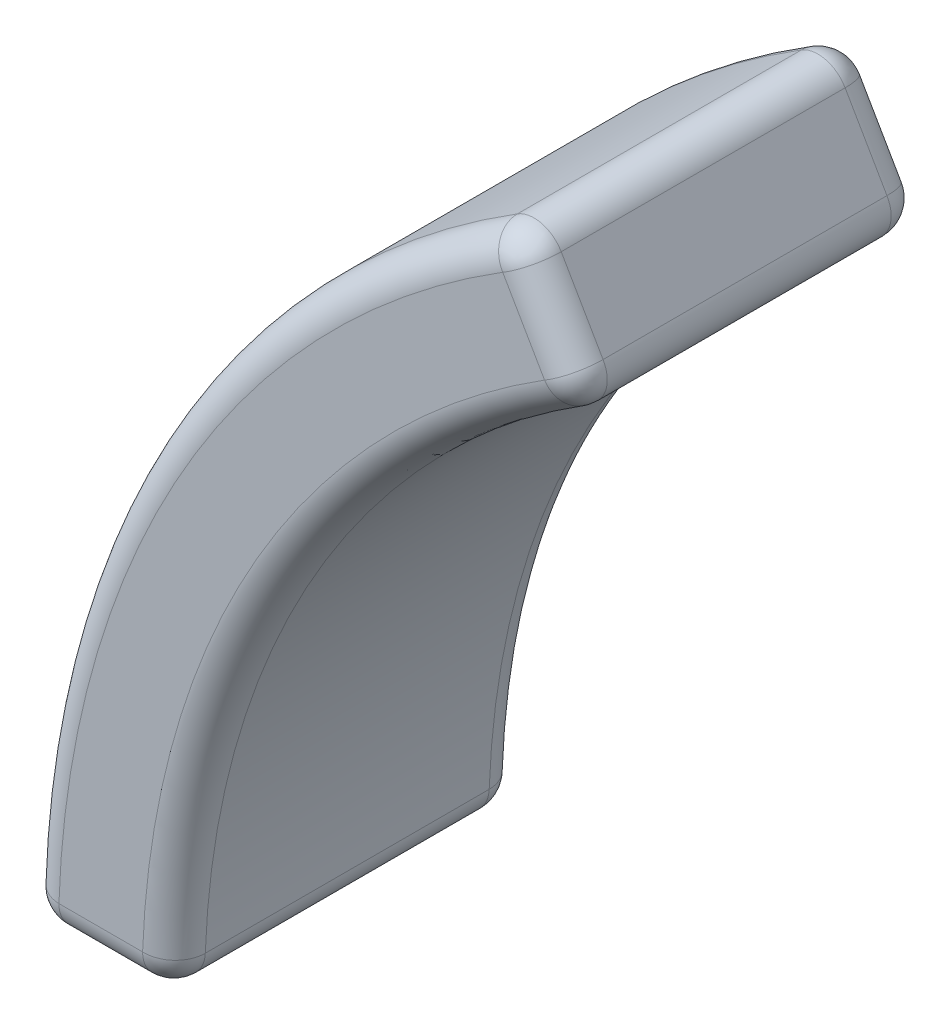
ISO-10303-21;
HEADER;
FILE_DESCRIPTION(('STEP AP214'),'2;1');
FILE_NAME('part.step','',(''),(''),'','','');
FILE_SCHEMA(('AUTOMOTIVE_DESIGN { 1 0 10303 214 1 1 1 1 }'));
ENDSEC;
DATA;
#1=APPLICATION_CONTEXT('core data for automotive mechanical design processes');
#2=APPLICATION_PROTOCOL_DEFINITION('international standard','automotive_design',2000,#1);
#3=PRODUCT_CONTEXT('',#1,'mechanical');
#4=PRODUCT('Part','Part','',(#3));
#5=PRODUCT_RELATED_PRODUCT_CATEGORY('part','',(#4));
#6=PRODUCT_DEFINITION_FORMATION('','',#4);
#7=PRODUCT_DEFINITION_CONTEXT('part definition',#1,'design');
#8=PRODUCT_DEFINITION('design','',#6,#7);
#9=PRODUCT_DEFINITION_SHAPE('','',#8);
#10=(LENGTH_UNIT() NAMED_UNIT(*) SI_UNIT(.MILLI.,.METRE.));
#11=(NAMED_UNIT(*) PLANE_ANGLE_UNIT() SI_UNIT($,.RADIAN.));
#12=(NAMED_UNIT(*) SI_UNIT($,.STERADIAN.) SOLID_ANGLE_UNIT());
#13=UNCERTAINTY_MEASURE_WITH_UNIT(LENGTH_MEASURE(1.E-05),#10,'distance_accuracy_value','');
#14=(GEOMETRIC_REPRESENTATION_CONTEXT(3) GLOBAL_UNCERTAINTY_ASSIGNED_CONTEXT((#13)) GLOBAL_UNIT_ASSIGNED_CONTEXT((#10,
#11,#12)) REPRESENTATION_CONTEXT('',''));
#15=CARTESIAN_POINT('',(0.,0.,0.));
#16=DIRECTION('',(0.,0.,1.));
#17=DIRECTION('',(1.,0.,0.));
#18=AXIS2_PLACEMENT_3D('',#15,#16,#17);
#19=CARTESIAN_POINT('',(0.,0.,-331.6));
#20=DIRECTION('',(0.,0.,1.));
#21=DIRECTION('',(1.,0.,0.));
#22=AXIS2_PLACEMENT_3D('',#19,#20,#21);
#23=CYLINDRICAL_SURFACE('',#22,791.6);
#24=CARTESIAN_POINT('',(0.,0.,-301.6));
#25=DIRECTION('',(0.,0.,1.));
#26=DIRECTION('',(1.,0.,0.));
#27=AXIS2_PLACEMENT_3D('',#24,#25,#26);
#28=CIRCLE('',#27,791.6);
#29=CARTESIAN_POINT('',(-791.072111416553,28.904576436222,-301.6));
#30=VERTEX_POINT('',#29);
#31=CARTESIAN_POINT('',(-420.568153187672,670.636256494018,-301.6));
#32=VERTEX_POINT('',#31);
#33=EDGE_CURVE('E250',#30,#32,#28,.F.);
#34=ORIENTED_EDGE('',*,*,#33,.T.);
#35=DIRECTION('',(0.,0.,1.));
#36=VECTOR('',#35,1.);
#37=CARTESIAN_POINT('',(-420.568153187672,670.636256494018,-331.6));
#38=LINE('',#37,#36);
#39=CARTESIAN_POINT('',(-420.568153187672,670.636256494018,-30.));
#40=VERTEX_POINT('',#39);
#41=EDGE_CURVE('E262',#32,#40,#38,.T.);
#42=ORIENTED_EDGE('',*,*,#41,.T.);
#43=CARTESIAN_POINT('',(0.,0.,-30.));
#44=DIRECTION('',(0.,0.,1.));
#45=DIRECTION('',(1.,0.,0.));
#46=AXIS2_PLACEMENT_3D('',#43,#44,#45);
#47=CIRCLE('',#46,791.6);
#48=CARTESIAN_POINT('',(-791.072111416553,28.904576436222,-30.));
#49=VERTEX_POINT('',#48);
#50=EDGE_CURVE('E254',#40,#49,#47,.T.);
#51=ORIENTED_EDGE('',*,*,#50,.T.);
#52=DIRECTION('',(0.,0.,1.));
#53=VECTOR('',#52,1.);
#54=CARTESIAN_POINT('',(-791.072111416553,28.904576436222,-331.6));
#55=LINE('',#54,#53);
#56=EDGE_CURVE('E246',#49,#30,#55,.F.);
#57=ORIENTED_EDGE('',*,*,#56,.T.);
#58=EDGE_LOOP('',(#34,#42,#51,#57));
#59=FACE_BOUND('',#58,.T.);
#60=ADVANCED_FACE('F43',(#59),#23,.F.);
#61=CARTESIAN_POINT('',(-791.6,0.,-331.6));
#62=DIRECTION('',(0.,-1.,0.));
#63=DIRECTION('',(1.,0.,0.));
#64=AXIS2_PLACEMENT_3D('',#61,#62,#63);
#65=PLANE('',#64);
#66=DIRECTION('',(1.,0.,0.));
#67=VECTOR('',#66,1.);
#68=CARTESIAN_POINT('',(-791.6,0.,-30.));
#69=LINE('',#68,#67);
#70=CARTESIAN_POINT('',(-821.052105532895,0.,-30.));
#71=VERTEX_POINT('',#70);
#72=CARTESIAN_POINT('',(-901.100749084141,0.,-30.));
#73=VERTEX_POINT('',#72);
#74=EDGE_CURVE('E64',#71,#73,#69,.F.);
#75=ORIENTED_EDGE('',*,*,#74,.T.);
#76=DIRECTION('',(0.,0.,1.));
#77=VECTOR('',#76,1.);
#78=CARTESIAN_POINT('',(-901.100749084141,0.,-331.6));
#79=LINE('',#78,#77);
#80=CARTESIAN_POINT('',(-901.100749084141,0.,-301.6));
#81=VERTEX_POINT('',#80);
#82=EDGE_CURVE('E11',#73,#81,#79,.F.);
#83=ORIENTED_EDGE('',*,*,#82,.T.);
#84=DIRECTION('',(1.,0.,0.));
#85=VECTOR('',#84,1.);
#86=CARTESIAN_POINT('',(-791.6,0.,-301.6));
#87=LINE('',#86,#85);
#88=CARTESIAN_POINT('',(-821.052105532895,0.,-301.6));
#89=VERTEX_POINT('',#88);
#90=EDGE_CURVE('E53',#81,#89,#87,.T.);
#91=ORIENTED_EDGE('',*,*,#90,.T.);
#92=DIRECTION('',(0.,0.,1.));
#93=VECTOR('',#92,1.);
#94=CARTESIAN_POINT('',(-821.052105532895,0.,-331.6));
#95=LINE('',#94,#93);
#96=EDGE_CURVE('E245',#89,#71,#95,.T.);
#97=ORIENTED_EDGE('',*,*,#96,.T.);
#98=EDGE_LOOP('',(#75,#83,#91,#97));
#99=FACE_BOUND('',#98,.T.);
#100=ADVANCED_FACE('F384',(#99),#65,.T.);
#101=CARTESIAN_POINT('',(0.,0.,-331.6));
#102=DIRECTION('',(0.,0.,1.));
#103=DIRECTION('',(1.,0.,0.));
#104=AXIS2_PLACEMENT_3D('',#101,#102,#103);
#105=CYLINDRICAL_SURFACE('',#104,931.6);
#106=CARTESIAN_POINT('',(0.,0.,-30.));
#107=DIRECTION('',(0.,0.,1.));
#108=DIRECTION('',(1.,0.,0.));
#109=AXIS2_PLACEMENT_3D('',#106,#107,#108);
#110=CIRCLE('',#109,931.6);
#111=CARTESIAN_POINT('',(-931.084136919682,30.9982253771074,-30.));
#112=VERTEX_POINT('',#111);
#113=CARTESIAN_POINT('',(-492.38731910865,790.843402944601,-30.));
#114=VERTEX_POINT('',#113);
#115=EDGE_CURVE('E332',#112,#114,#110,.F.);
#116=ORIENTED_EDGE('',*,*,#115,.T.);
#117=DIRECTION('',(0.,0.,1.));
#118=VECTOR('',#117,1.);
#119=CARTESIAN_POINT('',(-492.38731910865,790.843402944601,-331.6));
#120=LINE('',#119,#118);
#121=CARTESIAN_POINT('',(-492.38731910865,790.843402944601,-301.6));
#122=VERTEX_POINT('',#121);
#123=EDGE_CURVE('E169',#114,#122,#120,.F.);
#124=ORIENTED_EDGE('',*,*,#123,.T.);
#125=CARTESIAN_POINT('',(0.,0.,-301.6));
#126=DIRECTION('',(0.,0.,1.));
#127=DIRECTION('',(1.,0.,0.));
#128=AXIS2_PLACEMENT_3D('',#125,#126,#127);
#129=CIRCLE('',#128,931.6);
#130=CARTESIAN_POINT('',(-931.084136919682,30.9982253771074,-301.6));
#131=VERTEX_POINT('',#130);
#132=EDGE_CURVE('E256',#122,#131,#129,.T.);
#133=ORIENTED_EDGE('',*,*,#132,.T.);
#134=DIRECTION('',(0.,0.,1.));
#135=VECTOR('',#134,1.);
#136=CARTESIAN_POINT('',(-931.084136919682,30.9982253771074,-331.6));
#137=LINE('',#136,#135);
#138=EDGE_CURVE('E328',#131,#112,#137,.T.);
#139=ORIENTED_EDGE('',*,*,#138,.T.);
#140=EDGE_LOOP('',(#116,#124,#133,#139));
#141=FACE_BOUND('',#140,.T.);
#142=ADVANCED_FACE('F341',(#141),#105,.T.);
#143=CARTESIAN_POINT('',(-395.799999999999,685.545709635763,-331.6));
#144=DIRECTION('',(0.86602540378444,0.499999999999998,0.));
#145=DIRECTION('',(-0.499999999999998,0.86602540378444,0.));
#146=AXIS2_PLACEMENT_3D('',#143,#144,#145);
#147=PLANE('',#146);
#148=DIRECTION('',(0.,0.,1.));
#149=VECTOR('',#148,1.);
#150=CARTESIAN_POINT('',(-410.526052766446,711.05198122219,-331.6));
#151=LINE('',#150,#149);
#152=CARTESIAN_POINT('',(-410.526052766446,711.05198122219,-30.));
#153=VERTEX_POINT('',#152);
#154=CARTESIAN_POINT('',(-410.526052766446,711.05198122219,-301.6));
#155=VERTEX_POINT('',#154);
#156=EDGE_CURVE('E144',#153,#155,#151,.F.);
#157=ORIENTED_EDGE('',*,*,#156,.T.);
#158=DIRECTION('',(-0.499999999999998,0.86602540378444,0.));
#159=VECTOR('',#158,1.);
#160=CARTESIAN_POINT('',(-465.799999999998,806.789266165584,-301.6));
#161=LINE('',#160,#159);
#162=CARTESIAN_POINT('',(-450.550374542069,780.376140076054,-301.6));
#163=VERTEX_POINT('',#162);
#164=EDGE_CURVE('E139',#155,#163,#161,.T.);
#165=ORIENTED_EDGE('',*,*,#164,.T.);
#166=DIRECTION('',(0.,0.,1.));
#167=VECTOR('',#166,1.);
#168=CARTESIAN_POINT('',(-450.550374542069,780.376140076054,-331.6));
#169=LINE('',#168,#167);
#170=CARTESIAN_POINT('',(-450.550374542069,780.376140076054,-30.));
#171=VERTEX_POINT('',#170);
#172=EDGE_CURVE('E133',#163,#171,#169,.T.);
#173=ORIENTED_EDGE('',*,*,#172,.T.);
#174=DIRECTION('',(-0.499999999999998,0.86602540378444,0.));
#175=VECTOR('',#174,1.);
#176=CARTESIAN_POINT('',(-395.799999999999,685.545709635763,-30.));
#177=LINE('',#176,#175);
#178=EDGE_CURVE('E136',#171,#153,#177,.F.);
#179=ORIENTED_EDGE('',*,*,#178,.T.);
#180=EDGE_LOOP('',(#157,#165,#173,#179));
#181=FACE_BOUND('',#180,.T.);
#182=ADVANCED_FACE('F135',(#181),#147,.T.);
#183=CARTESIAN_POINT('',(0.,0.,-331.6));
#184=DIRECTION('',(0.,0.,1.));
#185=DIRECTION('',(1.,0.,0.));
#186=AXIS2_PLACEMENT_3D('',#183,#184,#185);
#187=PLANE('',#186);
#188=CARTESIAN_POINT('',(0.,0.,-331.6));
#189=DIRECTION('',(0.,0.,1.));
#190=DIRECTION('',(1.,0.,0.));
#191=AXIS2_PLACEMENT_3D('',#188,#189,#190);
#192=CIRCLE('',#191,901.6);
#193=CARTESIAN_POINT('',(-901.100749084141,30.,-331.6));
#194=VERTEX_POINT('',#193);
#195=CARTESIAN_POINT('',(-476.531136655602,765.376140076054,-331.6));
#196=VERTEX_POINT('',#195);
#197=EDGE_CURVE('E317',#194,#196,#192,.F.);
#198=ORIENTED_EDGE('',*,*,#197,.T.);
#199=DIRECTION('',(-0.499999999999998,0.86602540378444,0.));
#200=VECTOR('',#199,1.);
#201=CARTESIAN_POINT('',(-421.780762113532,670.545709635763,-331.6));
#202=LINE('',#201,#200);
#203=CARTESIAN_POINT('',(-436.506814879979,696.05198122219,-331.6));
#204=VERTEX_POINT('',#203);
#205=EDGE_CURVE('E321',#196,#204,#202,.F.);
#206=ORIENTED_EDGE('',*,*,#205,.T.);
#207=CARTESIAN_POINT('',(0.,0.,-331.6));
#208=DIRECTION('',(0.,0.,1.));
#209=DIRECTION('',(1.,0.,0.));
#210=AXIS2_PLACEMENT_3D('',#207,#208,#209);
#211=CIRCLE('',#210,821.6);
#212=CARTESIAN_POINT('',(-821.052105532895,30.,-331.6));
#213=VERTEX_POINT('',#212);
#214=EDGE_CURVE('E311',#204,#213,#211,.T.);
#215=ORIENTED_EDGE('',*,*,#214,.T.);
#216=DIRECTION('',(1.,0.,0.));
#217=VECTOR('',#216,1.);
#218=CARTESIAN_POINT('',(-931.6,30.,-331.6));
#219=LINE('',#218,#217);
#220=EDGE_CURVE('E318',#213,#194,#219,.F.);
#221=ORIENTED_EDGE('',*,*,#220,.T.);
#222=EDGE_LOOP('',(#198,#206,#215,#221));
#223=FACE_BOUND('',#222,.T.);
#224=ADVANCED_FACE('F322',(#223),#187,.F.);
#225=CARTESIAN_POINT('',(0.,0.,0.));
#226=DIRECTION('',(0.,0.,1.));
#227=DIRECTION('',(1.,0.,0.));
#228=AXIS2_PLACEMENT_3D('',#225,#226,#227);
#229=PLANE('',#228);
#230=CARTESIAN_POINT('',(0.,0.,0.));
#231=DIRECTION('',(0.,0.,1.));
#232=DIRECTION('',(1.,0.,0.));
#233=AXIS2_PLACEMENT_3D('',#230,#231,#232);
#234=CIRCLE('',#233,821.6);
#235=CARTESIAN_POINT('',(-821.052105532895,30.,0.));
#236=VERTEX_POINT('',#235);
#237=CARTESIAN_POINT('',(-436.506814879979,696.05198122219,0.));
#238=VERTEX_POINT('',#237);
#239=EDGE_CURVE('E269',#236,#238,#234,.F.);
#240=ORIENTED_EDGE('',*,*,#239,.T.);
#241=DIRECTION('',(-0.499999999999998,0.86602540378444,0.));
#242=VECTOR('',#241,1.);
#243=CARTESIAN_POINT('',(-25.980762113533,-14.9999999999998,0.));
#244=LINE('',#243,#242);
#245=CARTESIAN_POINT('',(-476.531136655602,765.376140076054,0.));
#246=VERTEX_POINT('',#245);
#247=EDGE_CURVE('E275',#238,#246,#244,.T.);
#248=ORIENTED_EDGE('',*,*,#247,.T.);
#249=CARTESIAN_POINT('',(0.,0.,0.));
#250=DIRECTION('',(0.,0.,1.));
#251=DIRECTION('',(1.,0.,0.));
#252=AXIS2_PLACEMENT_3D('',#249,#250,#251);
#253=CIRCLE('',#252,901.6);
#254=CARTESIAN_POINT('',(-901.100749084141,30.,0.));
#255=VERTEX_POINT('',#254);
#256=EDGE_CURVE('E272',#246,#255,#253,.T.);
#257=ORIENTED_EDGE('',*,*,#256,.T.);
#258=DIRECTION('',(1.,0.,0.));
#259=VECTOR('',#258,1.);
#260=CARTESIAN_POINT('',(0.,30.,0.));
#261=LINE('',#260,#259);
#262=EDGE_CURVE('E266',#255,#236,#261,.T.);
#263=ORIENTED_EDGE('',*,*,#262,.T.);
#264=EDGE_LOOP('',(#240,#248,#257,#263));
#265=FACE_BOUND('',#264,.T.);
#266=ADVANCED_FACE('F369',(#265),#229,.T.);
#267=CARTESIAN_POINT('',(0.,30.,-30.));
#268=DIRECTION('',(1.,0.,0.));
#269=DIRECTION('',(0.,1.,0.));
#270=AXIS2_PLACEMENT_3D('',#267,#268,#269);
#271=CYLINDRICAL_SURFACE('',#270,30.);
#272=CARTESIAN_POINT('',(-821.052105532895,30.,-30.));
#273=DIRECTION('',(1.,0.,0.));
#274=DIRECTION('',(0.,0.,-1.));
#275=AXIS2_PLACEMENT_3D('',#272,#273,#274);
#276=CIRCLE('',#275,30.);
#277=EDGE_CURVE('E47',#236,#71,#276,.T.);
#278=ORIENTED_EDGE('',*,*,#277,.F.);
#279=ORIENTED_EDGE('',*,*,#262,.F.);
#280=CARTESIAN_POINT('',(-901.100749084141,30.,-30.));
#281=DIRECTION('',(-1.,0.,0.));
#282=DIRECTION('',(0.,0.,1.));
#283=AXIS2_PLACEMENT_3D('',#280,#281,#282);
#284=CIRCLE('',#283,30.);
#285=EDGE_CURVE('E224',#73,#255,#284,.T.);
#286=ORIENTED_EDGE('',*,*,#285,.F.);
#287=ORIENTED_EDGE('',*,*,#74,.F.);
#288=EDGE_LOOP('',(#278,#279,#286,#287));
#289=FACE_BOUND('',#288,.T.);
#290=ADVANCED_FACE('F45',(#289),#271,.T.);
#291=CARTESIAN_POINT('',(-821.052105532895,30.,-30.));
#292=DIRECTION('',(0.,0.,1.));
#293=DIRECTION('',(1.,0.,0.));
#294=AXIS2_PLACEMENT_3D('',#291,#292,#293);
#295=SPHERICAL_SURFACE('',#294,30.);
#296=CARTESIAN_POINT('',(-821.052105532895,30.,-30.));
#297=DIRECTION('',(-0.0365141187925998,-0.999333137211411,0.));
#298=DIRECTION('',(0.999333137211411,-0.0365141187925998,0.));
#299=AXIS2_PLACEMENT_3D('',#296,#297,#298);
#300=CIRCLE('',#299,30.);
#301=EDGE_CURVE('E217',#236,#49,#300,.F.);
#302=ORIENTED_EDGE('',*,*,#301,.F.);
#303=ORIENTED_EDGE('',*,*,#277,.T.);
#304=CARTESIAN_POINT('',(-821.052105532895,30.,-30.));
#305=DIRECTION('',(0.,0.,1.));
#306=DIRECTION('',(1.,0.,0.));
#307=AXIS2_PLACEMENT_3D('',#304,#305,#306);
#308=CIRCLE('',#307,30.);
#309=EDGE_CURVE('E221',#49,#71,#308,.F.);
#310=ORIENTED_EDGE('',*,*,#309,.F.);
#311=EDGE_LOOP('',(#302,#303,#310));
#312=FACE_BOUND('',#311,.T.);
#313=ADVANCED_FACE('F236',(#312),#295,.T.);
#314=CARTESIAN_POINT('',(-901.100749084141,30.,-30.));
#315=DIRECTION('',(0.,0.,1.));
#316=DIRECTION('',(1.,0.,0.));
#317=AXIS2_PLACEMENT_3D('',#314,#315,#316);
#318=SPHERICAL_SURFACE('',#317,30.);
#319=CARTESIAN_POINT('',(-901.100749084141,30.,-30.));
#320=DIRECTION('',(0.,0.,1.));
#321=DIRECTION('',(0.,-1.,0.));
#322=AXIS2_PLACEMENT_3D('',#319,#320,#321);
#323=CIRCLE('',#322,30.);
#324=EDGE_CURVE('E209',#73,#112,#323,.F.);
#325=ORIENTED_EDGE('',*,*,#324,.F.);
#326=ORIENTED_EDGE('',*,*,#285,.T.);
#327=CARTESIAN_POINT('',(-901.100749084141,30.,-30.));
#328=DIRECTION('',(-0.0332741792369122,-0.999446261184717,0.));
#329=DIRECTION('',(0.999446261184717,-0.0332741792369122,0.));
#330=AXIS2_PLACEMENT_3D('',#327,#328,#329);
#331=CIRCLE('',#330,30.);
#332=EDGE_CURVE('E213',#112,#255,#331,.F.);
#333=ORIENTED_EDGE('',*,*,#332,.F.);
#334=EDGE_LOOP('',(#325,#326,#333));
#335=FACE_BOUND('',#334,.T.);
#336=ADVANCED_FACE('F370',(#335),#318,.T.);
#337=CARTESIAN_POINT('',(-821.052105532895,30.,-331.6));
#338=DIRECTION('',(0.,0.,1.));
#339=DIRECTION('',(1.,0.,0.));
#340=AXIS2_PLACEMENT_3D('',#337,#338,#339);
#341=CYLINDRICAL_SURFACE('',#340,30.);
#342=ORIENTED_EDGE('',*,*,#309,.T.);
#343=ORIENTED_EDGE('',*,*,#96,.F.);
#344=CARTESIAN_POINT('',(-821.052105532895,30.,-301.6));
#345=DIRECTION('',(0.,0.,-1.));
#346=DIRECTION('',(-1.,0.,0.));
#347=AXIS2_PLACEMENT_3D('',#344,#345,#346);
#348=CIRCLE('',#347,30.);
#349=EDGE_CURVE('E202',#30,#89,#348,.T.);
#350=ORIENTED_EDGE('',*,*,#349,.F.);
#351=ORIENTED_EDGE('',*,*,#56,.F.);
#352=EDGE_LOOP('',(#342,#343,#350,#351));
#353=FACE_BOUND('',#352,.T.);
#354=ADVANCED_FACE('F243',(#353),#341,.T.);
#355=CARTESIAN_POINT('',(0.,0.,-30.));
#356=DIRECTION('',(0.,0.,1.));
#357=DIRECTION('',(1.,0.,0.));
#358=AXIS2_PLACEMENT_3D('',#355,#356,#357);
#359=TOROIDAL_SURFACE('',#358,821.6,30.);
#360=ORIENTED_EDGE('',*,*,#301,.T.);
#361=ORIENTED_EDGE('',*,*,#50,.F.);
#362=CARTESIAN_POINT('',(-436.506814879979,696.05198122219,-30.));
#363=DIRECTION('',(0.847190824272382,0.531288723076899,0.));
#364=DIRECTION('',(-0.531288723076899,0.847190824272382,0.));
#365=AXIS2_PLACEMENT_3D('',#362,#363,#364);
#366=CIRCLE('',#365,30.);
#367=EDGE_CURVE('E198',#238,#40,#366,.T.);
#368=ORIENTED_EDGE('',*,*,#367,.F.);
#369=ORIENTED_EDGE('',*,*,#239,.F.);
#370=EDGE_LOOP('',(#360,#361,#368,#369));
#371=FACE_BOUND('',#370,.T.);
#372=ADVANCED_FACE('F367',(#371),#359,.T.);
#373=CARTESIAN_POINT('',(-25.980762113533,-14.9999999999998,-30.));
#374=DIRECTION('',(-0.499999999999998,0.86602540378444,0.));
#375=DIRECTION('',(-0.86602540378444,-0.499999999999998,0.));
#376=AXIS2_PLACEMENT_3D('',#373,#374,#375);
#377=CYLINDRICAL_SURFACE('',#376,30.);
#378=CARTESIAN_POINT('',(-476.531136655602,765.376140076054,-30.));
#379=DIRECTION('',(-0.499999999999998,0.86602540378444,0.));
#380=DIRECTION('',(-0.86602540378444,-0.499999999999998,0.));
#381=AXIS2_PLACEMENT_3D('',#378,#379,#380);
#382=CIRCLE('',#381,30.);
#383=EDGE_CURVE('E151',#246,#171,#382,.T.);
#384=ORIENTED_EDGE('',*,*,#383,.F.);
#385=ORIENTED_EDGE('',*,*,#247,.F.);
#386=CARTESIAN_POINT('',(-436.506814879979,696.05198122219,-30.));
#387=DIRECTION('',(0.499999999999997,-0.86602540378444,0.));
#388=DIRECTION('',(0.86602540378444,0.499999999999997,0.));
#389=AXIS2_PLACEMENT_3D('',#386,#387,#388);
#390=CIRCLE('',#389,30.);
#391=EDGE_CURVE('E154',#153,#238,#390,.T.);
#392=ORIENTED_EDGE('',*,*,#391,.F.);
#393=ORIENTED_EDGE('',*,*,#178,.F.);
#394=EDGE_LOOP('',(#384,#385,#392,#393));
#395=FACE_BOUND('',#394,.T.);
#396=ADVANCED_FACE('F149',(#395),#377,.T.);
#397=CARTESIAN_POINT('',(0.,0.,-30.));
#398=DIRECTION('',(0.,0.,1.));
#399=DIRECTION('',(1.,0.,0.));
#400=AXIS2_PLACEMENT_3D('',#397,#398,#399);
#401=TOROIDAL_SURFACE('',#400,901.6,30.);
#402=ORIENTED_EDGE('',*,*,#332,.T.);
#403=ORIENTED_EDGE('',*,*,#256,.F.);
#404=CARTESIAN_POINT('',(-476.531136655602,765.376140076054,-30.));
#405=DIRECTION('',(0.848908762284887,0.5285394151016,0.));
#406=DIRECTION('',(-0.5285394151016,0.848908762284887,0.));
#407=AXIS2_PLACEMENT_3D('',#404,#405,#406);
#408=CIRCLE('',#407,30.);
#409=EDGE_CURVE('E164',#114,#246,#408,.T.);
#410=ORIENTED_EDGE('',*,*,#409,.F.);
#411=ORIENTED_EDGE('',*,*,#115,.F.);
#412=EDGE_LOOP('',(#402,#403,#410,#411));
#413=FACE_BOUND('',#412,.T.);
#414=ADVANCED_FACE('F373',(#413),#401,.T.);
#415=CARTESIAN_POINT('',(-901.100749084141,30.,-331.6));
#416=DIRECTION('',(0.,0.,1.));
#417=DIRECTION('',(1.,0.,0.));
#418=AXIS2_PLACEMENT_3D('',#415,#416,#417);
#419=CYLINDRICAL_SURFACE('',#418,30.);
#420=ORIENTED_EDGE('',*,*,#324,.T.);
#421=ORIENTED_EDGE('',*,*,#138,.F.);
#422=CARTESIAN_POINT('',(-901.100749084141,30.,-301.6));
#423=DIRECTION('',(0.,0.,-1.));
#424=DIRECTION('',(-1.,0.,0.));
#425=AXIS2_PLACEMENT_3D('',#422,#423,#424);
#426=CIRCLE('',#425,30.);
#427=EDGE_CURVE('E190',#81,#131,#426,.T.);
#428=ORIENTED_EDGE('',*,*,#427,.F.);
#429=ORIENTED_EDGE('',*,*,#82,.F.);
#430=EDGE_LOOP('',(#420,#421,#428,#429));
#431=FACE_BOUND('',#430,.T.);
#432=ADVANCED_FACE('F345',(#431),#419,.T.);
#433=CARTESIAN_POINT('',(-791.6,30.,-301.6));
#434=DIRECTION('',(-1.,0.,0.));
#435=DIRECTION('',(0.,-1.,0.));
#436=AXIS2_PLACEMENT_3D('',#433,#434,#435);
#437=CYLINDRICAL_SURFACE('',#436,30.);
#438=CARTESIAN_POINT('',(-821.052105532895,30.,-301.6));
#439=DIRECTION('',(1.,0.,0.));
#440=DIRECTION('',(0.,0.,-1.));
#441=AXIS2_PLACEMENT_3D('',#438,#439,#440);
#442=CIRCLE('',#441,30.);
#443=EDGE_CURVE('E205',#89,#213,#442,.T.);
#444=ORIENTED_EDGE('',*,*,#443,.F.);
#445=ORIENTED_EDGE('',*,*,#90,.F.);
#446=CARTESIAN_POINT('',(-901.100749084141,30.,-301.6));
#447=DIRECTION('',(-1.,0.,0.));
#448=DIRECTION('',(0.,0.,1.));
#449=AXIS2_PLACEMENT_3D('',#446,#447,#448);
#450=CIRCLE('',#449,30.);
#451=EDGE_CURVE('E186',#194,#81,#450,.T.);
#452=ORIENTED_EDGE('',*,*,#451,.F.);
#453=ORIENTED_EDGE('',*,*,#220,.F.);
#454=EDGE_LOOP('',(#444,#445,#452,#453));
#455=FACE_BOUND('',#454,.T.);
#456=ADVANCED_FACE('F380',(#455),#437,.T.);
#457=CARTESIAN_POINT('',(-821.052105532895,30.,-301.6));
#458=DIRECTION('',(0.,0.,1.));
#459=DIRECTION('',(1.,0.,0.));
#460=AXIS2_PLACEMENT_3D('',#457,#458,#459);
#461=SPHERICAL_SURFACE('',#460,30.);
#462=ORIENTED_EDGE('',*,*,#349,.T.);
#463=ORIENTED_EDGE('',*,*,#443,.T.);
#464=CARTESIAN_POINT('',(-821.052105532895,30.,-301.6));
#465=DIRECTION('',(-0.0365141187925998,-0.999333137211411,0.));
#466=DIRECTION('',(0.999333137211411,-0.0365141187925998,0.));
#467=AXIS2_PLACEMENT_3D('',#464,#465,#466);
#468=CIRCLE('',#467,30.);
#469=EDGE_CURVE('E176',#30,#213,#468,.F.);
#470=ORIENTED_EDGE('',*,*,#469,.F.);
#471=EDGE_LOOP('',(#462,#463,#470));
#472=FACE_BOUND('',#471,.T.);
#473=ADVANCED_FACE('F414',(#472),#461,.T.);
#474=CARTESIAN_POINT('',(-436.506814879979,696.05198122219,-30.));
#475=DIRECTION('',(0.,0.,1.));
#476=DIRECTION('',(1.,0.,0.));
#477=AXIS2_PLACEMENT_3D('',#474,#475,#476);
#478=SPHERICAL_SURFACE('',#477,30.);
#479=ORIENTED_EDGE('',*,*,#391,.T.);
#480=ORIENTED_EDGE('',*,*,#367,.T.);
#481=CARTESIAN_POINT('',(-436.506814879979,696.05198122219,-30.));
#482=DIRECTION('',(0.,0.,1.));
#483=DIRECTION('',(1.,0.,0.));
#484=AXIS2_PLACEMENT_3D('',#481,#482,#483);
#485=CIRCLE('',#484,30.);
#486=EDGE_CURVE('E171',#153,#40,#485,.F.);
#487=ORIENTED_EDGE('',*,*,#486,.F.);
#488=EDGE_LOOP('',(#479,#480,#487));
#489=FACE_BOUND('',#488,.T.);
#490=ADVANCED_FACE('F411',(#489),#478,.T.);
#491=CARTESIAN_POINT('',(-476.531136655602,765.376140076054,-30.));
#492=DIRECTION('',(0.,0.,1.));
#493=DIRECTION('',(1.,0.,0.));
#494=AXIS2_PLACEMENT_3D('',#491,#492,#493);
#495=SPHERICAL_SURFACE('',#494,30.);
#496=ORIENTED_EDGE('',*,*,#409,.T.);
#497=ORIENTED_EDGE('',*,*,#383,.T.);
#498=CARTESIAN_POINT('',(-476.531136655602,765.376140076054,-30.));
#499=DIRECTION('',(0.,0.,1.));
#500=DIRECTION('',(0.,-1.,0.));
#501=AXIS2_PLACEMENT_3D('',#498,#499,#500);
#502=CIRCLE('',#501,30.);
#503=EDGE_CURVE('E161',#114,#171,#502,.F.);
#504=ORIENTED_EDGE('',*,*,#503,.F.);
#505=EDGE_LOOP('',(#496,#497,#504));
#506=FACE_BOUND('',#505,.T.);
#507=ADVANCED_FACE('F160',(#506),#495,.T.);
#508=CARTESIAN_POINT('',(-901.100749084141,30.,-301.6));
#509=DIRECTION('',(0.,0.,1.));
#510=DIRECTION('',(1.,0.,0.));
#511=AXIS2_PLACEMENT_3D('',#508,#509,#510);
#512=SPHERICAL_SURFACE('',#511,30.);
#513=ORIENTED_EDGE('',*,*,#451,.T.);
#514=ORIENTED_EDGE('',*,*,#427,.T.);
#515=CARTESIAN_POINT('',(-901.100749084141,30.,-301.6));
#516=DIRECTION('',(-0.0332741792369121,-0.999446261184717,0.));
#517=DIRECTION('',(0.999446261184717,-0.0332741792369121,0.));
#518=AXIS2_PLACEMENT_3D('',#515,#516,#517);
#519=CIRCLE('',#518,30.);
#520=EDGE_CURVE('E172',#194,#131,#519,.F.);
#521=ORIENTED_EDGE('',*,*,#520,.F.);
#522=EDGE_LOOP('',(#513,#514,#521));
#523=FACE_BOUND('',#522,.T.);
#524=ADVANCED_FACE('F348',(#523),#512,.T.);
#525=CARTESIAN_POINT('',(0.,0.,-301.6));
#526=DIRECTION('',(0.,0.,1.));
#527=DIRECTION('',(1.,0.,0.));
#528=AXIS2_PLACEMENT_3D('',#525,#526,#527);
#529=TOROIDAL_SURFACE('',#528,821.6,30.);
#530=ORIENTED_EDGE('',*,*,#469,.T.);
#531=ORIENTED_EDGE('',*,*,#214,.F.);
#532=CARTESIAN_POINT('',(-436.506814879979,696.05198122219,-301.6));
#533=DIRECTION('',(0.847190824272382,0.531288723076899,0.));
#534=DIRECTION('',(-0.531288723076899,0.847190824272382,0.));
#535=AXIS2_PLACEMENT_3D('',#532,#533,#534);
#536=CIRCLE('',#535,30.);
#537=EDGE_CURVE('E179',#32,#204,#536,.T.);
#538=ORIENTED_EDGE('',*,*,#537,.F.);
#539=ORIENTED_EDGE('',*,*,#33,.F.);
#540=EDGE_LOOP('',(#530,#531,#538,#539));
#541=FACE_BOUND('',#540,.T.);
#542=ADVANCED_FACE('F313',(#541),#529,.T.);
#543=CARTESIAN_POINT('',(-436.506814879979,696.05198122219,-331.6));
#544=DIRECTION('',(0.,0.,1.));
#545=DIRECTION('',(1.,0.,0.));
#546=AXIS2_PLACEMENT_3D('',#543,#544,#545);
#547=CYLINDRICAL_SURFACE('',#546,30.);
#548=ORIENTED_EDGE('',*,*,#486,.T.);
#549=ORIENTED_EDGE('',*,*,#41,.F.);
#550=CARTESIAN_POINT('',(-436.506814879979,696.05198122219,-301.6));
#551=DIRECTION('',(0.,0.,-1.));
#552=DIRECTION('',(-1.,0.,0.));
#553=AXIS2_PLACEMENT_3D('',#550,#551,#552);
#554=CIRCLE('',#553,30.);
#555=EDGE_CURVE('E298',#155,#32,#554,.T.);
#556=ORIENTED_EDGE('',*,*,#555,.F.);
#557=ORIENTED_EDGE('',*,*,#156,.F.);
#558=EDGE_LOOP('',(#548,#549,#556,#557));
#559=FACE_BOUND('',#558,.T.);
#560=ADVANCED_FACE('F363',(#559),#547,.T.);
#561=CARTESIAN_POINT('',(-476.531136655602,765.376140076054,-331.6));
#562=DIRECTION('',(0.,0.,1.));
#563=DIRECTION('',(1.,0.,0.));
#564=AXIS2_PLACEMENT_3D('',#561,#562,#563);
#565=CYLINDRICAL_SURFACE('',#564,30.);
#566=ORIENTED_EDGE('',*,*,#503,.T.);
#567=ORIENTED_EDGE('',*,*,#172,.F.);
#568=CARTESIAN_POINT('',(-476.531136655602,765.376140076054,-301.6));
#569=DIRECTION('',(0.,0.,-1.));
#570=DIRECTION('',(-1.,0.,0.));
#571=AXIS2_PLACEMENT_3D('',#568,#569,#570);
#572=CIRCLE('',#571,30.);
#573=EDGE_CURVE('E294',#122,#163,#572,.T.);
#574=ORIENTED_EDGE('',*,*,#573,.F.);
#575=ORIENTED_EDGE('',*,*,#123,.F.);
#576=EDGE_LOOP('',(#566,#567,#574,#575));
#577=FACE_BOUND('',#576,.T.);
#578=ADVANCED_FACE('F167',(#577),#565,.T.);
#579=CARTESIAN_POINT('',(0.,0.,-301.6));
#580=DIRECTION('',(0.,0.,1.));
#581=DIRECTION('',(1.,0.,0.));
#582=AXIS2_PLACEMENT_3D('',#579,#580,#581);
#583=TOROIDAL_SURFACE('',#582,901.6,30.);
#584=ORIENTED_EDGE('',*,*,#520,.T.);
#585=ORIENTED_EDGE('',*,*,#132,.F.);
#586=CARTESIAN_POINT('',(-476.531136655602,765.376140076054,-301.6));
#587=DIRECTION('',(0.848908762284888,0.528539415101598,0.));
#588=DIRECTION('',(-0.528539415101598,0.848908762284888,0.));
#589=AXIS2_PLACEMENT_3D('',#586,#587,#588);
#590=CIRCLE('',#589,30.);
#591=EDGE_CURVE('E291',#196,#122,#590,.T.);
#592=ORIENTED_EDGE('',*,*,#591,.F.);
#593=ORIENTED_EDGE('',*,*,#197,.F.);
#594=EDGE_LOOP('',(#584,#585,#592,#593));
#595=FACE_BOUND('',#594,.T.);
#596=ADVANCED_FACE('F350',(#595),#583,.T.);
#597=CARTESIAN_POINT('',(-436.506814879979,696.05198122219,-301.6));
#598=DIRECTION('',(0.,0.,1.));
#599=DIRECTION('',(1.,0.,0.));
#600=AXIS2_PLACEMENT_3D('',#597,#598,#599);
#601=SPHERICAL_SURFACE('',#600,30.);
#602=ORIENTED_EDGE('',*,*,#555,.T.);
#603=ORIENTED_EDGE('',*,*,#537,.T.);
#604=CARTESIAN_POINT('',(-436.506814879979,696.05198122219,-301.6));
#605=DIRECTION('',(0.499999999999997,-0.86602540378444,0.));
#606=DIRECTION('',(0.86602540378444,0.499999999999997,0.));
#607=AXIS2_PLACEMENT_3D('',#604,#605,#606);
#608=CIRCLE('',#607,30.);
#609=EDGE_CURVE('E288',#155,#204,#608,.F.);
#610=ORIENTED_EDGE('',*,*,#609,.F.);
#611=EDGE_LOOP('',(#602,#603,#610));
#612=FACE_BOUND('',#611,.T.);
#613=ADVANCED_FACE('F307',(#612),#601,.T.);
#614=CARTESIAN_POINT('',(-476.531136655602,765.376140076054,-301.6));
#615=DIRECTION('',(0.,0.,1.));
#616=DIRECTION('',(1.,0.,0.));
#617=AXIS2_PLACEMENT_3D('',#614,#615,#616);
#618=SPHERICAL_SURFACE('',#617,30.);
#619=ORIENTED_EDGE('',*,*,#591,.T.);
#620=ORIENTED_EDGE('',*,*,#573,.T.);
#621=CARTESIAN_POINT('',(-476.531136655602,765.376140076054,-301.6));
#622=DIRECTION('',(-0.499999999999997,0.86602540378444,0.));
#623=DIRECTION('',(-0.86602540378444,-0.499999999999997,0.));
#624=AXIS2_PLACEMENT_3D('',#621,#622,#623);
#625=CIRCLE('',#624,30.);
#626=EDGE_CURVE('E285',#196,#163,#625,.F.);
#627=ORIENTED_EDGE('',*,*,#626,.F.);
#628=EDGE_LOOP('',(#619,#620,#627));
#629=FACE_BOUND('',#628,.T.);
#630=ADVANCED_FACE('F352',(#629),#618,.T.);
#631=CARTESIAN_POINT('',(-421.780762113532,670.545709635763,-301.6));
#632=DIRECTION('',(0.499999999999998,-0.86602540378444,0.));
#633=DIRECTION('',(0.86602540378444,0.499999999999998,0.));
#634=AXIS2_PLACEMENT_3D('',#631,#632,#633);
#635=CYLINDRICAL_SURFACE('',#634,30.);
#636=ORIENTED_EDGE('',*,*,#609,.T.);
#637=ORIENTED_EDGE('',*,*,#205,.F.);
#638=ORIENTED_EDGE('',*,*,#626,.T.);
#639=ORIENTED_EDGE('',*,*,#164,.F.);
#640=EDGE_LOOP('',(#636,#637,#638,#639));
#641=FACE_BOUND('',#640,.T.);
#642=ADVANCED_FACE('F353',(#641),#635,.T.);
#643=CLOSED_SHELL('',(#60,#100,#142,#182,#224,#266,#290,#313,#336,#354,#372,#396,#414,#432,#456,
#473,#490,#507,#524,#542,#560,#578,#596,#613,#630,#642));
#644=MANIFOLD_SOLID_BREP('B2',#643);
#645=ADVANCED_BREP_SHAPE_REPRESENTATION('',(#18,#644),#14);
#646=SHAPE_DEFINITION_REPRESENTATION(#9,#645);
ENDSEC;
END-ISO-10303-21;
